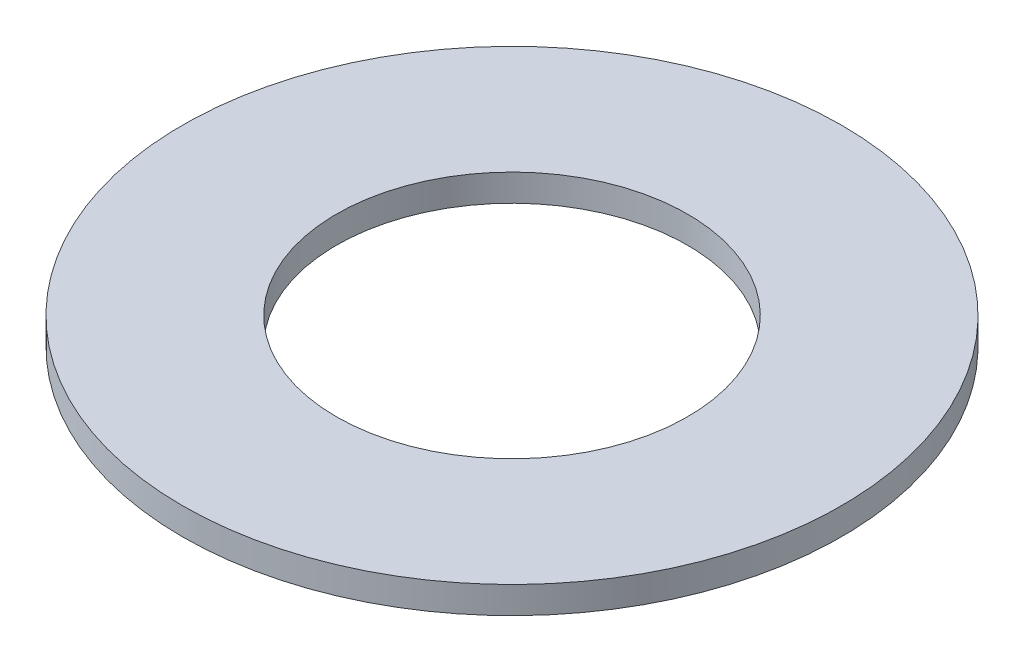
ISO-10303-21;
HEADER;
FILE_DESCRIPTION(('STEP AP214'),'2;1');
FILE_NAME('part.step','',(''),(''),'','','');
FILE_SCHEMA(('AUTOMOTIVE_DESIGN { 1 0 10303 214 1 1 1 1 }'));
ENDSEC;
DATA;
#1=APPLICATION_CONTEXT('core data for automotive mechanical design processes');
#2=APPLICATION_PROTOCOL_DEFINITION('international standard','automotive_design',2000,#1);
#3=PRODUCT_CONTEXT('',#1,'mechanical');
#4=PRODUCT('Part','Part','',(#3));
#5=PRODUCT_RELATED_PRODUCT_CATEGORY('part','',(#4));
#6=PRODUCT_DEFINITION_FORMATION('','',#4);
#7=PRODUCT_DEFINITION_CONTEXT('part definition',#1,'design');
#8=PRODUCT_DEFINITION('design','',#6,#7);
#9=PRODUCT_DEFINITION_SHAPE('','',#8);
#10=(LENGTH_UNIT() NAMED_UNIT(*) SI_UNIT(.MILLI.,.METRE.));
#11=(NAMED_UNIT(*) PLANE_ANGLE_UNIT() SI_UNIT($,.RADIAN.));
#12=(NAMED_UNIT(*) SI_UNIT($,.STERADIAN.) SOLID_ANGLE_UNIT());
#13=UNCERTAINTY_MEASURE_WITH_UNIT(LENGTH_MEASURE(1.E-05),#10,'distance_accuracy_value','');
#14=(GEOMETRIC_REPRESENTATION_CONTEXT(3) GLOBAL_UNCERTAINTY_ASSIGNED_CONTEXT((#13)) GLOBAL_UNIT_ASSIGNED_CONTEXT((#10,
#11,#12)) REPRESENTATION_CONTEXT('',''));
#15=CARTESIAN_POINT('',(0.,0.,0.));
#16=DIRECTION('',(0.,0.,1.));
#17=DIRECTION('',(1.,0.,0.));
#18=AXIS2_PLACEMENT_3D('',#15,#16,#17);
#19=CARTESIAN_POINT('',(0.,0.65,0.));
#20=DIRECTION('',(0.,1.,0.));
#21=DIRECTION('',(0.,0.,1.));
#22=AXIS2_PLACEMENT_3D('',#19,#20,#21);
#23=PLANE('',#22);
#24=CARTESIAN_POINT('',(0.,0.65,0.));
#25=DIRECTION('',(0.,1.,0.));
#26=DIRECTION('',(0.,0.,1.));
#27=AXIS2_PLACEMENT_3D('',#24,#25,#26);
#28=CIRCLE('',#27,7.9375);
#29=CARTESIAN_POINT('',(0.,0.65,7.9375));
#30=VERTEX_POINT('',#29);
#31=EDGE_CURVE('E10',#30,#30,#28,.T.);
#32=ORIENTED_EDGE('',*,*,#31,.T.);
#33=EDGE_LOOP('',(#32));
#34=FACE_BOUND('',#33,.T.);
#35=CARTESIAN_POINT('',(0.,0.65,0.));
#36=DIRECTION('',(0.,1.,0.));
#37=DIRECTION('',(0.,0.,1.));
#38=AXIS2_PLACEMENT_3D('',#35,#36,#37);
#39=CIRCLE('',#38,4.229);
#40=CARTESIAN_POINT('',(0.,0.65,4.229));
#41=VERTEX_POINT('',#40);
#42=EDGE_CURVE('E45',#41,#41,#39,.T.);
#43=ORIENTED_EDGE('',*,*,#42,.F.);
#44=EDGE_LOOP('',(#43));
#45=FACE_BOUND('',#44,.T.);
#46=ADVANCED_FACE('F34',(#34,#45),#23,.T.);
#47=CARTESIAN_POINT('',(0.,0.,0.));
#48=DIRECTION('',(0.,1.,0.));
#49=DIRECTION('',(0.,0.,1.));
#50=AXIS2_PLACEMENT_3D('',#47,#48,#49);
#51=PLANE('',#50);
#52=CARTESIAN_POINT('',(0.,0.,0.));
#53=DIRECTION('',(0.,1.,0.));
#54=DIRECTION('',(0.,0.,1.));
#55=AXIS2_PLACEMENT_3D('',#52,#53,#54);
#56=CIRCLE('',#55,7.9375);
#57=CARTESIAN_POINT('',(0.,0.,7.9375));
#58=VERTEX_POINT('',#57);
#59=EDGE_CURVE('E38',#58,#58,#56,.T.);
#60=ORIENTED_EDGE('',*,*,#59,.F.);
#61=EDGE_LOOP('',(#60));
#62=FACE_BOUND('',#61,.T.);
#63=CARTESIAN_POINT('',(0.,0.,0.));
#64=DIRECTION('',(0.,1.,0.));
#65=DIRECTION('',(0.,0.,1.));
#66=AXIS2_PLACEMENT_3D('',#63,#64,#65);
#67=CIRCLE('',#66,4.229);
#68=CARTESIAN_POINT('',(0.,0.,4.229));
#69=VERTEX_POINT('',#68);
#70=EDGE_CURVE('E47',#69,#69,#67,.T.);
#71=ORIENTED_EDGE('',*,*,#70,.T.);
#72=EDGE_LOOP('',(#71));
#73=FACE_BOUND('',#72,.T.);
#74=ADVANCED_FACE('F57',(#62,#73),#51,.F.);
#75=CARTESIAN_POINT('',(0.,0.65,0.));
#76=DIRECTION('',(0.,-1.,0.));
#77=DIRECTION('',(0.,0.,-1.));
#78=AXIS2_PLACEMENT_3D('',#75,#76,#77);
#79=CYLINDRICAL_SURFACE('',#78,7.9375);
#80=ORIENTED_EDGE('',*,*,#31,.F.);
#81=EDGE_LOOP('',(#80));
#82=FACE_BOUND('',#81,.T.);
#83=ORIENTED_EDGE('',*,*,#59,.T.);
#84=EDGE_LOOP('',(#83));
#85=FACE_BOUND('',#84,.T.);
#86=ADVANCED_FACE('F36',(#82,#85),#79,.T.);
#87=CARTESIAN_POINT('',(0.,0.65,0.));
#88=DIRECTION('',(0.,-1.,0.));
#89=DIRECTION('',(0.,0.,-1.));
#90=AXIS2_PLACEMENT_3D('',#87,#88,#89);
#91=CYLINDRICAL_SURFACE('',#90,4.229);
#92=ORIENTED_EDGE('',*,*,#42,.T.);
#93=EDGE_LOOP('',(#92));
#94=FACE_BOUND('',#93,.T.);
#95=ORIENTED_EDGE('',*,*,#70,.F.);
#96=EDGE_LOOP('',(#95));
#97=FACE_BOUND('',#96,.T.);
#98=ADVANCED_FACE('F53',(#94,#97),#91,.F.);
#99=CLOSED_SHELL('',(#46,#74,#86,#98));
#100=MANIFOLD_SOLID_BREP('B2',#99);
#101=ADVANCED_BREP_SHAPE_REPRESENTATION('',(#18,#100),#14);
#102=SHAPE_DEFINITION_REPRESENTATION(#9,#101);
ENDSEC;
END-ISO-10303-21;
